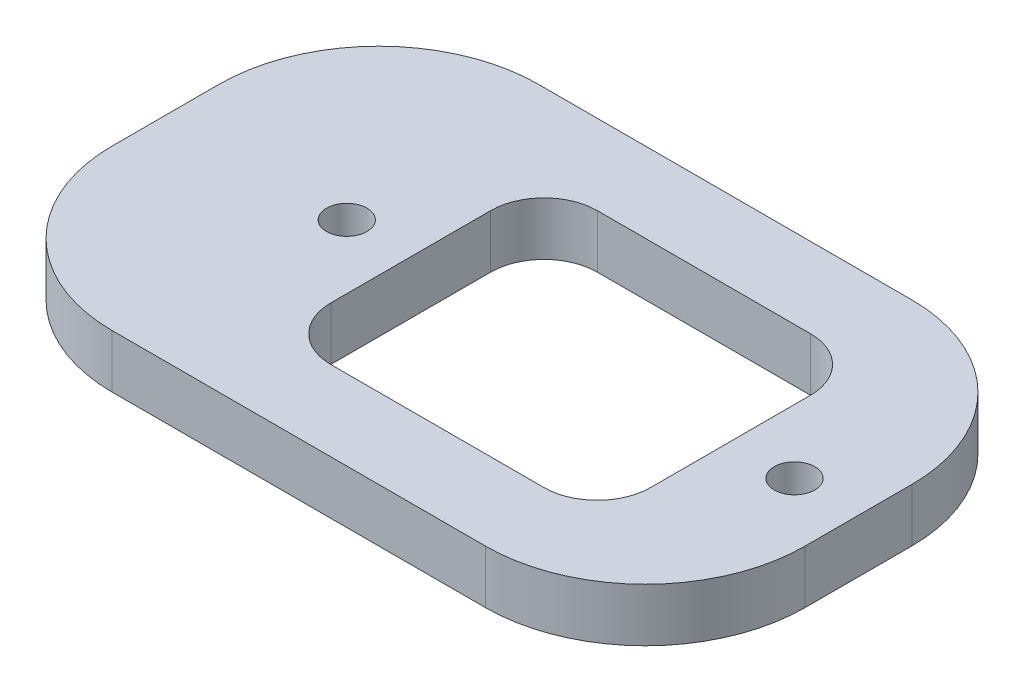
ISO-10303-21;
HEADER;
FILE_DESCRIPTION(('STEP AP214'),'2;1');
FILE_NAME('part.step','',(''),(''),'','','');
FILE_SCHEMA(('AUTOMOTIVE_DESIGN { 1 0 10303 214 1 1 1 1 }'));
ENDSEC;
DATA;
#1=APPLICATION_CONTEXT('core data for automotive mechanical design processes');
#2=APPLICATION_PROTOCOL_DEFINITION('international standard','automotive_design',2000,#1);
#3=PRODUCT_CONTEXT('',#1,'mechanical');
#4=PRODUCT('Part','Part','',(#3));
#5=PRODUCT_RELATED_PRODUCT_CATEGORY('part','',(#4));
#6=PRODUCT_DEFINITION_FORMATION('','',#4);
#7=PRODUCT_DEFINITION_CONTEXT('part definition',#1,'design');
#8=PRODUCT_DEFINITION('design','',#6,#7);
#9=PRODUCT_DEFINITION_SHAPE('','',#8);
#10=(LENGTH_UNIT() NAMED_UNIT(*) SI_UNIT(.MILLI.,.METRE.));
#11=(NAMED_UNIT(*) PLANE_ANGLE_UNIT() SI_UNIT($,.RADIAN.));
#12=(NAMED_UNIT(*) SI_UNIT($,.STERADIAN.) SOLID_ANGLE_UNIT());
#13=UNCERTAINTY_MEASURE_WITH_UNIT(LENGTH_MEASURE(1.E-05),#10,'distance_accuracy_value','');
#14=(GEOMETRIC_REPRESENTATION_CONTEXT(3) GLOBAL_UNCERTAINTY_ASSIGNED_CONTEXT((#13)) GLOBAL_UNIT_ASSIGNED_CONTEXT((#10,
#11,#12)) REPRESENTATION_CONTEXT('',''));
#15=CARTESIAN_POINT('',(0.,0.,0.));
#16=DIRECTION('',(0.,0.,1.));
#17=DIRECTION('',(1.,0.,0.));
#18=AXIS2_PLACEMENT_3D('',#15,#16,#17);
#19=CARTESIAN_POINT('',(13.97,6.35,12.7));
#20=DIRECTION('',(0.,1.,0.));
#21=DIRECTION('',(0.,0.,1.));
#22=AXIS2_PLACEMENT_3D('',#19,#20,#21);
#23=PLANE('',#22);
#24=CARTESIAN_POINT('',(-27.94,6.35,19.05));
#25=DIRECTION('',(0.,-1.,0.));
#26=DIRECTION('',(0.,0.,-1.));
#27=AXIS2_PLACEMENT_3D('',#24,#25,#26);
#28=CIRCLE('',#27,2.413);
#29=CARTESIAN_POINT('',(-27.94,6.35,16.637));
#30=VERTEX_POINT('',#29);
#31=EDGE_CURVE('E385',#30,#30,#28,.T.);
#32=ORIENTED_EDGE('',*,*,#31,.T.);
#33=EDGE_LOOP('',(#32));
#34=FACE_BOUND('',#33,.T.);
#35=CARTESIAN_POINT('',(25.4,6.35,19.05));
#36=DIRECTION('',(0.,-1.,0.));
#37=DIRECTION('',(0.,0.,-1.));
#38=AXIS2_PLACEMENT_3D('',#35,#36,#37);
#39=CIRCLE('',#38,2.413);
#40=CARTESIAN_POINT('',(25.4,6.35,16.637));
#41=VERTEX_POINT('',#40);
#42=EDGE_CURVE('E183',#41,#41,#39,.T.);
#43=ORIENTED_EDGE('',*,*,#42,.T.);
#44=EDGE_LOOP('',(#43));
#45=FACE_BOUND('',#44,.T.);
#46=CARTESIAN_POINT('',(13.97,6.35,12.7));
#47=DIRECTION('',(0.,1.,0.));
#48=DIRECTION('',(0.,0.,1.));
#49=AXIS2_PLACEMENT_3D('',#46,#47,#48);
#50=CIRCLE('',#49,19.05);
#51=CARTESIAN_POINT('',(33.02,6.35,12.7));
#52=VERTEX_POINT('',#51);
#53=CARTESIAN_POINT('',(13.97,6.35,-6.34999999999997));
#54=VERTEX_POINT('',#53);
#55=EDGE_CURVE('E214',#52,#54,#50,.T.);
#56=ORIENTED_EDGE('',*,*,#55,.T.);
#57=DIRECTION('',(-1.,0.,0.));
#58=VECTOR('',#57,1.);
#59=CARTESIAN_POINT('',(13.97,6.35,-6.34999999999997));
#60=LINE('',#59,#58);
#61=CARTESIAN_POINT('',(-30.48,6.35,-6.34999999999997));
#62=VERTEX_POINT('',#61);
#63=EDGE_CURVE('E217',#54,#62,#60,.T.);
#64=ORIENTED_EDGE('',*,*,#63,.T.);
#65=CARTESIAN_POINT('',(-30.48,6.35,12.7));
#66=DIRECTION('',(0.,1.,0.));
#67=DIRECTION('',(0.,0.,1.));
#68=AXIS2_PLACEMENT_3D('',#65,#66,#67);
#69=CIRCLE('',#68,19.05);
#70=CARTESIAN_POINT('',(-49.53,6.35,12.7));
#71=VERTEX_POINT('',#70);
#72=EDGE_CURVE('E220',#62,#71,#69,.T.);
#73=ORIENTED_EDGE('',*,*,#72,.T.);
#74=DIRECTION('',(0.,0.,1.));
#75=VECTOR('',#74,1.);
#76=CARTESIAN_POINT('',(-49.53,6.35,12.7));
#77=LINE('',#76,#75);
#78=CARTESIAN_POINT('',(-49.53,6.35,25.4));
#79=VERTEX_POINT('',#78);
#80=EDGE_CURVE('E222',#71,#79,#77,.T.);
#81=ORIENTED_EDGE('',*,*,#80,.T.);
#82=CARTESIAN_POINT('',(-30.48,6.35,25.4));
#83=DIRECTION('',(0.,1.,0.));
#84=DIRECTION('',(0.,0.,1.));
#85=AXIS2_PLACEMENT_3D('',#82,#83,#84);
#86=CIRCLE('',#85,19.05);
#87=CARTESIAN_POINT('',(-30.48,6.35,44.45));
#88=VERTEX_POINT('',#87);
#89=EDGE_CURVE('E224',#79,#88,#86,.T.);
#90=ORIENTED_EDGE('',*,*,#89,.T.);
#91=DIRECTION('',(1.,0.,0.));
#92=VECTOR('',#91,1.);
#93=CARTESIAN_POINT('',(13.97,6.35,44.45));
#94=LINE('',#93,#92);
#95=CARTESIAN_POINT('',(13.97,6.35,44.45));
#96=VERTEX_POINT('',#95);
#97=EDGE_CURVE('E226',#88,#96,#94,.T.);
#98=ORIENTED_EDGE('',*,*,#97,.T.);
#99=CARTESIAN_POINT('',(13.97,6.35,25.4));
#100=DIRECTION('',(0.,1.,0.));
#101=DIRECTION('',(0.,0.,-1.));
#102=AXIS2_PLACEMENT_3D('',#99,#100,#101);
#103=CIRCLE('',#102,19.05);
#104=CARTESIAN_POINT('',(33.02,6.35,25.4));
#105=VERTEX_POINT('',#104);
#106=EDGE_CURVE('E228',#96,#105,#103,.T.);
#107=ORIENTED_EDGE('',*,*,#106,.T.);
#108=DIRECTION('',(0.,0.,-1.));
#109=VECTOR('',#108,1.);
#110=CARTESIAN_POINT('',(33.02,6.35,12.7));
#111=LINE('',#110,#109);
#112=EDGE_CURVE('E230',#105,#52,#111,.T.);
#113=ORIENTED_EDGE('',*,*,#112,.T.);
#114=EDGE_LOOP('',(#56,#64,#73,#81,#90,#98,#107,#113));
#115=FACE_BOUND('',#114,.T.);
#116=CARTESIAN_POINT('',(-13.97,6.35,28.575));
#117=DIRECTION('',(0.,1.,0.));
#118=DIRECTION('',(0.,0.,1.));
#119=AXIS2_PLACEMENT_3D('',#116,#117,#118);
#120=CIRCLE('',#119,6.35);
#121=CARTESIAN_POINT('',(-20.32,6.35,28.575));
#122=VERTEX_POINT('',#121);
#123=CARTESIAN_POINT('',(-13.9699999999999,6.35,34.925));
#124=VERTEX_POINT('',#123);
#125=EDGE_CURVE('E152',#122,#124,#120,.T.);
#126=ORIENTED_EDGE('',*,*,#125,.F.);
#127=DIRECTION('',(0.,0.,1.));
#128=VECTOR('',#127,1.);
#129=CARTESIAN_POINT('',(-20.32,6.35,12.7));
#130=LINE('',#129,#128);
#131=CARTESIAN_POINT('',(-20.32,6.35,9.52500000000009));
#132=VERTEX_POINT('',#131);
#133=EDGE_CURVE('E144',#132,#122,#130,.T.);
#134=ORIENTED_EDGE('',*,*,#133,.F.);
#135=CARTESIAN_POINT('',(-13.97,6.35,9.52500000000004));
#136=DIRECTION('',(0.,1.,0.));
#137=DIRECTION('',(0.,0.,-1.));
#138=AXIS2_PLACEMENT_3D('',#135,#136,#137);
#139=CIRCLE('',#138,6.35);
#140=CARTESIAN_POINT('',(-13.9699999999999,6.35,3.17500000000004));
#141=VERTEX_POINT('',#140);
#142=EDGE_CURVE('E179',#141,#132,#139,.T.);
#143=ORIENTED_EDGE('',*,*,#142,.F.);
#144=DIRECTION('',(-1.,0.,0.));
#145=VECTOR('',#144,1.);
#146=CARTESIAN_POINT('',(-13.9699999999999,6.35,3.17500000000004));
#147=LINE('',#146,#145);
#148=CARTESIAN_POINT('',(11.43,6.35,3.17500000000004));
#149=VERTEX_POINT('',#148);
#150=EDGE_CURVE('E177',#149,#141,#147,.T.);
#151=ORIENTED_EDGE('',*,*,#150,.F.);
#152=CARTESIAN_POINT('',(11.43,6.35,9.52500000000004));
#153=DIRECTION('',(0.,1.,0.));
#154=DIRECTION('',(0.,0.,1.));
#155=AXIS2_PLACEMENT_3D('',#152,#153,#154);
#156=CIRCLE('',#155,6.35);
#157=CARTESIAN_POINT('',(17.78,6.35,9.52500000000008));
#158=VERTEX_POINT('',#157);
#159=EDGE_CURVE('E175',#158,#149,#156,.T.);
#160=ORIENTED_EDGE('',*,*,#159,.F.);
#161=DIRECTION('',(0.,0.,-1.));
#162=VECTOR('',#161,1.);
#163=CARTESIAN_POINT('',(17.78,6.35,25.4));
#164=LINE('',#163,#162);
#165=CARTESIAN_POINT('',(17.78,6.35,28.575));
#166=VERTEX_POINT('',#165);
#167=EDGE_CURVE('E173',#166,#158,#164,.T.);
#168=ORIENTED_EDGE('',*,*,#167,.F.);
#169=CARTESIAN_POINT('',(11.43,6.35,28.575));
#170=DIRECTION('',(0.,1.,0.));
#171=DIRECTION('',(0.,0.,1.));
#172=AXIS2_PLACEMENT_3D('',#169,#170,#171);
#173=CIRCLE('',#172,6.35);
#174=CARTESIAN_POINT('',(11.43,6.35,34.925));
#175=VERTEX_POINT('',#174);
#176=EDGE_CURVE('E168',#175,#166,#173,.T.);
#177=ORIENTED_EDGE('',*,*,#176,.F.);
#178=DIRECTION('',(1.,0.,0.));
#179=VECTOR('',#178,1.);
#180=CARTESIAN_POINT('',(-13.9699999999999,6.35,34.925));
#181=LINE('',#180,#179);
#182=EDGE_CURVE('E166',#124,#175,#181,.T.);
#183=ORIENTED_EDGE('',*,*,#182,.F.);
#184=EDGE_LOOP('',(#126,#134,#143,#151,#160,#168,#177,#183));
#185=FACE_BOUND('',#184,.T.);
#186=ADVANCED_FACE('F33',(#34,#45,#115,#185),#23,.T.);
#187=CARTESIAN_POINT('',(13.97,0.,12.7));
#188=DIRECTION('',(0.,1.,0.));
#189=DIRECTION('',(0.,0.,1.));
#190=AXIS2_PLACEMENT_3D('',#187,#188,#189);
#191=PLANE('',#190);
#192=CARTESIAN_POINT('',(-27.94,0.,19.05));
#193=DIRECTION('',(0.,-1.,0.));
#194=DIRECTION('',(0.,0.,-1.));
#195=AXIS2_PLACEMENT_3D('',#192,#193,#194);
#196=CIRCLE('',#195,4.7625);
#197=CARTESIAN_POINT('',(-27.94,0.,14.2875));
#198=VERTEX_POINT('',#197);
#199=EDGE_CURVE('E383',#198,#198,#196,.T.);
#200=ORIENTED_EDGE('',*,*,#199,.F.);
#201=EDGE_LOOP('',(#200));
#202=FACE_BOUND('',#201,.T.);
#203=CARTESIAN_POINT('',(25.4,0.,19.05));
#204=DIRECTION('',(0.,-1.,0.));
#205=DIRECTION('',(0.,0.,-1.));
#206=AXIS2_PLACEMENT_3D('',#203,#204,#205);
#207=CIRCLE('',#206,4.7625);
#208=CARTESIAN_POINT('',(25.4,0.,14.2875));
#209=VERTEX_POINT('',#208);
#210=EDGE_CURVE('E389',#209,#209,#207,.T.);
#211=ORIENTED_EDGE('',*,*,#210,.F.);
#212=EDGE_LOOP('',(#211));
#213=FACE_BOUND('',#212,.T.);
#214=CARTESIAN_POINT('',(13.97,0.,12.7));
#215=DIRECTION('',(0.,1.,0.));
#216=DIRECTION('',(0.,0.,1.));
#217=AXIS2_PLACEMENT_3D('',#214,#215,#216);
#218=CIRCLE('',#217,19.05);
#219=CARTESIAN_POINT('',(33.02,0.,12.7));
#220=VERTEX_POINT('',#219);
#221=CARTESIAN_POINT('',(13.97,0.,-6.34999999999997));
#222=VERTEX_POINT('',#221);
#223=EDGE_CURVE('E161',#220,#222,#218,.T.);
#224=ORIENTED_EDGE('',*,*,#223,.F.);
#225=DIRECTION('',(0.,0.,-1.));
#226=VECTOR('',#225,1.);
#227=CARTESIAN_POINT('',(33.02,0.,12.7));
#228=LINE('',#227,#226);
#229=CARTESIAN_POINT('',(33.02,0.,25.4));
#230=VERTEX_POINT('',#229);
#231=EDGE_CURVE('E218',#230,#220,#228,.T.);
#232=ORIENTED_EDGE('',*,*,#231,.F.);
#233=CARTESIAN_POINT('',(13.97,0.,25.4));
#234=DIRECTION('',(0.,1.,0.));
#235=DIRECTION('',(0.,0.,-1.));
#236=AXIS2_PLACEMENT_3D('',#233,#234,#235);
#237=CIRCLE('',#236,19.05);
#238=CARTESIAN_POINT('',(13.97,0.,44.45));
#239=VERTEX_POINT('',#238);
#240=EDGE_CURVE('E245',#239,#230,#237,.T.);
#241=ORIENTED_EDGE('',*,*,#240,.F.);
#242=DIRECTION('',(1.,0.,0.));
#243=VECTOR('',#242,1.);
#244=CARTESIAN_POINT('',(13.97,0.,44.45));
#245=LINE('',#244,#243);
#246=CARTESIAN_POINT('',(-30.48,0.,44.45));
#247=VERTEX_POINT('',#246);
#248=EDGE_CURVE('E243',#247,#239,#245,.T.);
#249=ORIENTED_EDGE('',*,*,#248,.F.);
#250=CARTESIAN_POINT('',(-30.48,0.,25.4));
#251=DIRECTION('',(0.,1.,0.));
#252=DIRECTION('',(0.,0.,1.));
#253=AXIS2_PLACEMENT_3D('',#250,#251,#252);
#254=CIRCLE('',#253,19.05);
#255=CARTESIAN_POINT('',(-49.53,0.,25.4));
#256=VERTEX_POINT('',#255);
#257=EDGE_CURVE('E241',#256,#247,#254,.T.);
#258=ORIENTED_EDGE('',*,*,#257,.F.);
#259=DIRECTION('',(0.,0.,1.));
#260=VECTOR('',#259,1.);
#261=CARTESIAN_POINT('',(-49.53,0.,12.7));
#262=LINE('',#261,#260);
#263=CARTESIAN_POINT('',(-49.53,0.,12.7));
#264=VERTEX_POINT('',#263);
#265=EDGE_CURVE('E239',#264,#256,#262,.T.);
#266=ORIENTED_EDGE('',*,*,#265,.F.);
#267=CARTESIAN_POINT('',(-30.48,0.,12.7));
#268=DIRECTION('',(0.,1.,0.));
#269=DIRECTION('',(0.,0.,1.));
#270=AXIS2_PLACEMENT_3D('',#267,#268,#269);
#271=CIRCLE('',#270,19.05);
#272=CARTESIAN_POINT('',(-30.48,0.,-6.34999999999997));
#273=VERTEX_POINT('',#272);
#274=EDGE_CURVE('E237',#273,#264,#271,.T.);
#275=ORIENTED_EDGE('',*,*,#274,.F.);
#276=DIRECTION('',(-1.,0.,0.));
#277=VECTOR('',#276,1.);
#278=CARTESIAN_POINT('',(13.97,0.,-6.34999999999997));
#279=LINE('',#278,#277);
#280=EDGE_CURVE('E235',#222,#273,#279,.T.);
#281=ORIENTED_EDGE('',*,*,#280,.F.);
#282=EDGE_LOOP('',(#224,#232,#241,#249,#258,#266,#275,#281));
#283=FACE_BOUND('',#282,.T.);
#284=DIRECTION('',(0.,0.,1.));
#285=VECTOR('',#284,1.);
#286=CARTESIAN_POINT('',(-20.32,0.,25.4));
#287=LINE('',#286,#285);
#288=CARTESIAN_POINT('',(-20.32,0.,9.52500000000009));
#289=VERTEX_POINT('',#288);
#290=CARTESIAN_POINT('',(-20.32,0.,28.575));
#291=VERTEX_POINT('',#290);
#292=EDGE_CURVE('E181',#289,#291,#287,.T.);
#293=ORIENTED_EDGE('',*,*,#292,.T.);
#294=CARTESIAN_POINT('',(-13.97,0.,28.575));
#295=DIRECTION('',(0.,1.,0.));
#296=DIRECTION('',(0.,0.,1.));
#297=AXIS2_PLACEMENT_3D('',#294,#295,#296);
#298=CIRCLE('',#297,6.35);
#299=CARTESIAN_POINT('',(-13.9699999999999,0.,34.925));
#300=VERTEX_POINT('',#299);
#301=EDGE_CURVE('E159',#291,#300,#298,.T.);
#302=ORIENTED_EDGE('',*,*,#301,.T.);
#303=DIRECTION('',(1.,0.,0.));
#304=VECTOR('',#303,1.);
#305=CARTESIAN_POINT('',(-13.9699999999999,0.,34.925));
#306=LINE('',#305,#304);
#307=CARTESIAN_POINT('',(11.43,0.,34.925));
#308=VERTEX_POINT('',#307);
#309=EDGE_CURVE('E185',#300,#308,#306,.T.);
#310=ORIENTED_EDGE('',*,*,#309,.T.);
#311=CARTESIAN_POINT('',(11.43,0.,28.575));
#312=DIRECTION('',(0.,1.,0.));
#313=DIRECTION('',(0.,0.,1.));
#314=AXIS2_PLACEMENT_3D('',#311,#312,#313);
#315=CIRCLE('',#314,6.35);
#316=CARTESIAN_POINT('',(17.78,0.,28.575));
#317=VERTEX_POINT('',#316);
#318=EDGE_CURVE('E188',#308,#317,#315,.T.);
#319=ORIENTED_EDGE('',*,*,#318,.T.);
#320=DIRECTION('',(0.,0.,-1.));
#321=VECTOR('',#320,1.);
#322=CARTESIAN_POINT('',(17.78,0.,12.7));
#323=LINE('',#322,#321);
#324=CARTESIAN_POINT('',(17.78,0.,9.52500000000008));
#325=VERTEX_POINT('',#324);
#326=EDGE_CURVE('E191',#317,#325,#323,.T.);
#327=ORIENTED_EDGE('',*,*,#326,.T.);
#328=CARTESIAN_POINT('',(11.43,0.,9.52500000000004));
#329=DIRECTION('',(0.,1.,0.));
#330=DIRECTION('',(0.,0.,1.));
#331=AXIS2_PLACEMENT_3D('',#328,#329,#330);
#332=CIRCLE('',#331,6.35);
#333=CARTESIAN_POINT('',(11.43,0.,3.17500000000004));
#334=VERTEX_POINT('',#333);
#335=EDGE_CURVE('E194',#325,#334,#332,.T.);
#336=ORIENTED_EDGE('',*,*,#335,.T.);
#337=DIRECTION('',(-1.,0.,0.));
#338=VECTOR('',#337,1.);
#339=CARTESIAN_POINT('',(-13.9699999999999,0.,3.17500000000004));
#340=LINE('',#339,#338);
#341=CARTESIAN_POINT('',(-13.9699999999999,0.,3.17500000000004));
#342=VERTEX_POINT('',#341);
#343=EDGE_CURVE('E197',#334,#342,#340,.T.);
#344=ORIENTED_EDGE('',*,*,#343,.T.);
#345=CARTESIAN_POINT('',(-13.97,0.,9.52500000000004));
#346=DIRECTION('',(0.,1.,0.));
#347=DIRECTION('',(0.,0.,-1.));
#348=AXIS2_PLACEMENT_3D('',#345,#346,#347);
#349=CIRCLE('',#348,6.35);
#350=EDGE_CURVE('E153',#342,#289,#349,.T.);
#351=ORIENTED_EDGE('',*,*,#350,.T.);
#352=EDGE_LOOP('',(#293,#302,#310,#319,#327,#336,#344,#351));
#353=FACE_BOUND('',#352,.T.);
#354=ADVANCED_FACE('F275',(#202,#213,#283,#353),#191,.F.);
#355=CARTESIAN_POINT('',(13.97,6.35,12.7));
#356=DIRECTION('',(0.,-1.,0.));
#357=DIRECTION('',(0.,0.,-1.));
#358=AXIS2_PLACEMENT_3D('',#355,#356,#357);
#359=CYLINDRICAL_SURFACE('',#358,19.05);
#360=ORIENTED_EDGE('',*,*,#223,.T.);
#361=DIRECTION('',(0.,-1.,0.));
#362=VECTOR('',#361,1.);
#363=CARTESIAN_POINT('',(13.97,6.35,-6.34999999999997));
#364=LINE('',#363,#362);
#365=EDGE_CURVE('E11',#54,#222,#364,.T.);
#366=ORIENTED_EDGE('',*,*,#365,.F.);
#367=ORIENTED_EDGE('',*,*,#55,.F.);
#368=DIRECTION('',(0.,-1.,0.));
#369=VECTOR('',#368,1.);
#370=CARTESIAN_POINT('',(33.02,6.35,12.7));
#371=LINE('',#370,#369);
#372=EDGE_CURVE('E232',#52,#220,#371,.T.);
#373=ORIENTED_EDGE('',*,*,#372,.T.);
#374=EDGE_LOOP('',(#360,#366,#367,#373));
#375=FACE_BOUND('',#374,.T.);
#376=ADVANCED_FACE('F35',(#375),#359,.T.);
#377=CARTESIAN_POINT('',(13.97,6.35,-6.34999999999997));
#378=DIRECTION('',(0.,0.,1.));
#379=DIRECTION('',(1.,0.,0.));
#380=AXIS2_PLACEMENT_3D('',#377,#378,#379);
#381=PLANE('',#380);
#382=ORIENTED_EDGE('',*,*,#280,.T.);
#383=DIRECTION('',(0.,-1.,0.));
#384=VECTOR('',#383,1.);
#385=CARTESIAN_POINT('',(-30.48,6.35,-6.34999999999997));
#386=LINE('',#385,#384);
#387=EDGE_CURVE('E41',#62,#273,#386,.T.);
#388=ORIENTED_EDGE('',*,*,#387,.F.);
#389=ORIENTED_EDGE('',*,*,#63,.F.);
#390=ORIENTED_EDGE('',*,*,#365,.T.);
#391=EDGE_LOOP('',(#382,#388,#389,#390));
#392=FACE_BOUND('',#391,.T.);
#393=ADVANCED_FACE('F292',(#392),#381,.F.);
#394=CARTESIAN_POINT('',(-30.48,6.35,12.7));
#395=DIRECTION('',(0.,-1.,0.));
#396=DIRECTION('',(0.,0.,-1.));
#397=AXIS2_PLACEMENT_3D('',#394,#395,#396);
#398=CYLINDRICAL_SURFACE('',#397,19.05);
#399=ORIENTED_EDGE('',*,*,#274,.T.);
#400=DIRECTION('',(0.,-1.,0.));
#401=VECTOR('',#400,1.);
#402=CARTESIAN_POINT('',(-49.53,6.35,12.7));
#403=LINE('',#402,#401);
#404=EDGE_CURVE('E262',#71,#264,#403,.T.);
#405=ORIENTED_EDGE('',*,*,#404,.F.);
#406=ORIENTED_EDGE('',*,*,#72,.F.);
#407=ORIENTED_EDGE('',*,*,#387,.T.);
#408=EDGE_LOOP('',(#399,#405,#406,#407));
#409=FACE_BOUND('',#408,.T.);
#410=ADVANCED_FACE('F269',(#409),#398,.T.);
#411=CARTESIAN_POINT('',(-49.53,6.35,12.7));
#412=DIRECTION('',(1.,0.,0.));
#413=DIRECTION('',(0.,0.,-1.));
#414=AXIS2_PLACEMENT_3D('',#411,#412,#413);
#415=PLANE('',#414);
#416=ORIENTED_EDGE('',*,*,#265,.T.);
#417=DIRECTION('',(0.,-1.,0.));
#418=VECTOR('',#417,1.);
#419=CARTESIAN_POINT('',(-49.53,6.35,25.4));
#420=LINE('',#419,#418);
#421=EDGE_CURVE('E259',#79,#256,#420,.T.);
#422=ORIENTED_EDGE('',*,*,#421,.F.);
#423=ORIENTED_EDGE('',*,*,#80,.F.);
#424=ORIENTED_EDGE('',*,*,#404,.T.);
#425=EDGE_LOOP('',(#416,#422,#423,#424));
#426=FACE_BOUND('',#425,.T.);
#427=ADVANCED_FACE('F281',(#426),#415,.F.);
#428=CARTESIAN_POINT('',(-30.48,6.35,25.4));
#429=DIRECTION('',(0.,-1.,0.));
#430=DIRECTION('',(0.,0.,-1.));
#431=AXIS2_PLACEMENT_3D('',#428,#429,#430);
#432=CYLINDRICAL_SURFACE('',#431,19.05);
#433=ORIENTED_EDGE('',*,*,#257,.T.);
#434=DIRECTION('',(0.,-1.,0.));
#435=VECTOR('',#434,1.);
#436=CARTESIAN_POINT('',(-30.48,6.35,44.45));
#437=LINE('',#436,#435);
#438=EDGE_CURVE('E256',#88,#247,#437,.T.);
#439=ORIENTED_EDGE('',*,*,#438,.F.);
#440=ORIENTED_EDGE('',*,*,#89,.F.);
#441=ORIENTED_EDGE('',*,*,#421,.T.);
#442=EDGE_LOOP('',(#433,#439,#440,#441));
#443=FACE_BOUND('',#442,.T.);
#444=ADVANCED_FACE('F285',(#443),#432,.T.);
#445=CARTESIAN_POINT('',(13.97,6.35,44.45));
#446=DIRECTION('',(0.,0.,-1.));
#447=DIRECTION('',(-1.,0.,0.));
#448=AXIS2_PLACEMENT_3D('',#445,#446,#447);
#449=PLANE('',#448);
#450=ORIENTED_EDGE('',*,*,#248,.T.);
#451=DIRECTION('',(0.,-1.,0.));
#452=VECTOR('',#451,1.);
#453=CARTESIAN_POINT('',(13.97,6.35,44.45));
#454=LINE('',#453,#452);
#455=EDGE_CURVE('E253',#96,#239,#454,.T.);
#456=ORIENTED_EDGE('',*,*,#455,.F.);
#457=ORIENTED_EDGE('',*,*,#97,.F.);
#458=ORIENTED_EDGE('',*,*,#438,.T.);
#459=EDGE_LOOP('',(#450,#456,#457,#458));
#460=FACE_BOUND('',#459,.T.);
#461=ADVANCED_FACE('F305',(#460),#449,.F.);
#462=CARTESIAN_POINT('',(13.97,6.35,25.4));
#463=DIRECTION('',(0.,-1.,0.));
#464=DIRECTION('',(0.,0.,-1.));
#465=AXIS2_PLACEMENT_3D('',#462,#463,#464);
#466=CYLINDRICAL_SURFACE('',#465,19.05);
#467=ORIENTED_EDGE('',*,*,#240,.T.);
#468=DIRECTION('',(0.,-1.,0.));
#469=VECTOR('',#468,1.);
#470=CARTESIAN_POINT('',(33.02,6.35,25.4));
#471=LINE('',#470,#469);
#472=EDGE_CURVE('E250',#105,#230,#471,.T.);
#473=ORIENTED_EDGE('',*,*,#472,.F.);
#474=ORIENTED_EDGE('',*,*,#106,.F.);
#475=ORIENTED_EDGE('',*,*,#455,.T.);
#476=EDGE_LOOP('',(#467,#473,#474,#475));
#477=FACE_BOUND('',#476,.T.);
#478=ADVANCED_FACE('F303',(#477),#466,.T.);
#479=CARTESIAN_POINT('',(33.02,6.35,12.7));
#480=DIRECTION('',(-1.,0.,0.));
#481=DIRECTION('',(0.,0.,1.));
#482=AXIS2_PLACEMENT_3D('',#479,#480,#481);
#483=PLANE('',#482);
#484=ORIENTED_EDGE('',*,*,#231,.T.);
#485=ORIENTED_EDGE('',*,*,#372,.F.);
#486=ORIENTED_EDGE('',*,*,#112,.F.);
#487=ORIENTED_EDGE('',*,*,#472,.T.);
#488=EDGE_LOOP('',(#484,#485,#486,#487));
#489=FACE_BOUND('',#488,.T.);
#490=ADVANCED_FACE('F298',(#489),#483,.F.);
#491=CARTESIAN_POINT('',(-20.32,6.35,25.4));
#492=DIRECTION('',(1.,0.,0.));
#493=DIRECTION('',(0.,0.,-1.));
#494=AXIS2_PLACEMENT_3D('',#491,#492,#493);
#495=PLANE('',#494);
#496=ORIENTED_EDGE('',*,*,#292,.F.);
#497=DIRECTION('',(0.,-1.,0.));
#498=VECTOR('',#497,1.);
#499=CARTESIAN_POINT('',(-20.32,6.35,9.52500000000009));
#500=LINE('',#499,#498);
#501=EDGE_CURVE('E53',#132,#289,#500,.T.);
#502=ORIENTED_EDGE('',*,*,#501,.F.);
#503=ORIENTED_EDGE('',*,*,#133,.T.);
#504=DIRECTION('',(0.,-1.,0.));
#505=VECTOR('',#504,1.);
#506=CARTESIAN_POINT('',(-20.32,6.35,28.575));
#507=LINE('',#506,#505);
#508=EDGE_CURVE('E147',#122,#291,#507,.T.);
#509=ORIENTED_EDGE('',*,*,#508,.T.);
#510=EDGE_LOOP('',(#496,#502,#503,#509));
#511=FACE_BOUND('',#510,.T.);
#512=ADVANCED_FACE('F146',(#511),#495,.T.);
#513=CARTESIAN_POINT('',(-13.97,6.35,28.575));
#514=DIRECTION('',(0.,-1.,0.));
#515=DIRECTION('',(0.,0.,-1.));
#516=AXIS2_PLACEMENT_3D('',#513,#514,#515);
#517=CYLINDRICAL_SURFACE('',#516,6.35);
#518=ORIENTED_EDGE('',*,*,#301,.F.);
#519=ORIENTED_EDGE('',*,*,#508,.F.);
#520=ORIENTED_EDGE('',*,*,#125,.T.);
#521=DIRECTION('',(0.,-1.,0.));
#522=VECTOR('',#521,1.);
#523=CARTESIAN_POINT('',(-13.9699999999999,6.35,34.925));
#524=LINE('',#523,#522);
#525=EDGE_CURVE('E162',#124,#300,#524,.T.);
#526=ORIENTED_EDGE('',*,*,#525,.T.);
#527=EDGE_LOOP('',(#518,#519,#520,#526));
#528=FACE_BOUND('',#527,.T.);
#529=ADVANCED_FACE('F156',(#528),#517,.F.);
#530=CARTESIAN_POINT('',(-13.9699999999999,6.35,34.925));
#531=DIRECTION('',(0.,0.,-1.));
#532=DIRECTION('',(-1.,0.,0.));
#533=AXIS2_PLACEMENT_3D('',#530,#531,#532);
#534=PLANE('',#533);
#535=ORIENTED_EDGE('',*,*,#309,.F.);
#536=ORIENTED_EDGE('',*,*,#525,.F.);
#537=ORIENTED_EDGE('',*,*,#182,.T.);
#538=DIRECTION('',(0.,-1.,0.));
#539=VECTOR('',#538,1.);
#540=CARTESIAN_POINT('',(11.43,6.35,34.925));
#541=LINE('',#540,#539);
#542=EDGE_CURVE('E211',#175,#308,#541,.T.);
#543=ORIENTED_EDGE('',*,*,#542,.T.);
#544=EDGE_LOOP('',(#535,#536,#537,#543));
#545=FACE_BOUND('',#544,.T.);
#546=ADVANCED_FACE('F334',(#545),#534,.T.);
#547=CARTESIAN_POINT('',(11.43,6.35,28.575));
#548=DIRECTION('',(0.,-1.,0.));
#549=DIRECTION('',(0.,0.,-1.));
#550=AXIS2_PLACEMENT_3D('',#547,#548,#549);
#551=CYLINDRICAL_SURFACE('',#550,6.35);
#552=ORIENTED_EDGE('',*,*,#318,.F.);
#553=ORIENTED_EDGE('',*,*,#542,.F.);
#554=ORIENTED_EDGE('',*,*,#176,.T.);
#555=DIRECTION('',(0.,-1.,0.));
#556=VECTOR('',#555,1.);
#557=CARTESIAN_POINT('',(17.78,6.35,28.575));
#558=LINE('',#557,#556);
#559=EDGE_CURVE('E208',#166,#317,#558,.T.);
#560=ORIENTED_EDGE('',*,*,#559,.T.);
#561=EDGE_LOOP('',(#552,#553,#554,#560));
#562=FACE_BOUND('',#561,.T.);
#563=ADVANCED_FACE('F338',(#562),#551,.F.);
#564=CARTESIAN_POINT('',(17.78,6.35,12.7));
#565=DIRECTION('',(-1.,0.,0.));
#566=DIRECTION('',(0.,0.,1.));
#567=AXIS2_PLACEMENT_3D('',#564,#565,#566);
#568=PLANE('',#567);
#569=ORIENTED_EDGE('',*,*,#326,.F.);
#570=ORIENTED_EDGE('',*,*,#559,.F.);
#571=ORIENTED_EDGE('',*,*,#167,.T.);
#572=DIRECTION('',(0.,-1.,0.));
#573=VECTOR('',#572,1.);
#574=CARTESIAN_POINT('',(17.78,6.35,9.52500000000008));
#575=LINE('',#574,#573);
#576=EDGE_CURVE('E206',#158,#325,#575,.T.);
#577=ORIENTED_EDGE('',*,*,#576,.T.);
#578=EDGE_LOOP('',(#569,#570,#571,#577));
#579=FACE_BOUND('',#578,.T.);
#580=ADVANCED_FACE('F344',(#579),#568,.T.);
#581=CARTESIAN_POINT('',(11.43,6.35,9.52500000000004));
#582=DIRECTION('',(0.,-1.,0.));
#583=DIRECTION('',(0.,0.,-1.));
#584=AXIS2_PLACEMENT_3D('',#581,#582,#583);
#585=CYLINDRICAL_SURFACE('',#584,6.35);
#586=ORIENTED_EDGE('',*,*,#335,.F.);
#587=ORIENTED_EDGE('',*,*,#576,.F.);
#588=ORIENTED_EDGE('',*,*,#159,.T.);
#589=DIRECTION('',(0.,-1.,0.));
#590=VECTOR('',#589,1.);
#591=CARTESIAN_POINT('',(11.43,6.35,3.17500000000004));
#592=LINE('',#591,#590);
#593=EDGE_CURVE('E204',#149,#334,#592,.T.);
#594=ORIENTED_EDGE('',*,*,#593,.T.);
#595=EDGE_LOOP('',(#586,#587,#588,#594));
#596=FACE_BOUND('',#595,.T.);
#597=ADVANCED_FACE('F348',(#596),#585,.F.);
#598=CARTESIAN_POINT('',(-13.9699999999999,6.35,3.17500000000004));
#599=DIRECTION('',(0.,0.,1.));
#600=DIRECTION('',(1.,0.,0.));
#601=AXIS2_PLACEMENT_3D('',#598,#599,#600);
#602=PLANE('',#601);
#603=ORIENTED_EDGE('',*,*,#343,.F.);
#604=ORIENTED_EDGE('',*,*,#593,.F.);
#605=ORIENTED_EDGE('',*,*,#150,.T.);
#606=DIRECTION('',(0.,-1.,0.));
#607=VECTOR('',#606,1.);
#608=CARTESIAN_POINT('',(-13.9699999999999,6.35,3.17500000000004));
#609=LINE('',#608,#607);
#610=EDGE_CURVE('E48',#141,#342,#609,.T.);
#611=ORIENTED_EDGE('',*,*,#610,.T.);
#612=EDGE_LOOP('',(#603,#604,#605,#611));
#613=FACE_BOUND('',#612,.T.);
#614=ADVANCED_FACE('F352',(#613),#602,.T.);
#615=CARTESIAN_POINT('',(-13.97,6.35,9.52500000000004));
#616=DIRECTION('',(0.,-1.,0.));
#617=DIRECTION('',(0.,0.,-1.));
#618=AXIS2_PLACEMENT_3D('',#615,#616,#617);
#619=CYLINDRICAL_SURFACE('',#618,6.35);
#620=ORIENTED_EDGE('',*,*,#350,.F.);
#621=ORIENTED_EDGE('',*,*,#610,.F.);
#622=ORIENTED_EDGE('',*,*,#142,.T.);
#623=ORIENTED_EDGE('',*,*,#501,.T.);
#624=EDGE_LOOP('',(#620,#621,#622,#623));
#625=FACE_BOUND('',#624,.T.);
#626=ADVANCED_FACE('F356',(#625),#619,.F.);
#627=CARTESIAN_POINT('',(25.4,0.,19.05));
#628=DIRECTION('',(0.,-1.,0.));
#629=DIRECTION('',(0.,0.,-1.));
#630=AXIS2_PLACEMENT_3D('',#627,#628,#629);
#631=CYLINDRICAL_SURFACE('',#630,2.413);
#632=ORIENTED_EDGE('',*,*,#42,.F.);
#633=EDGE_LOOP('',(#632));
#634=FACE_BOUND('',#633,.T.);
#635=CARTESIAN_POINT('',(25.4,2.70279057276576,19.05));
#636=DIRECTION('',(0.,-1.,0.));
#637=DIRECTION('',(0.,0.,-1.));
#638=AXIS2_PLACEMENT_3D('',#635,#636,#637);
#639=CIRCLE('',#638,2.413);
#640=CARTESIAN_POINT('',(25.4,2.70279057276576,16.637));
#641=VERTEX_POINT('',#640);
#642=EDGE_CURVE('E392',#641,#641,#639,.T.);
#643=ORIENTED_EDGE('',*,*,#642,.T.);
#644=EDGE_LOOP('',(#643));
#645=FACE_BOUND('',#644,.T.);
#646=ADVANCED_FACE('F360',(#634,#645),#631,.F.);
#647=CARTESIAN_POINT('',(25.4,0.,19.05));
#648=DIRECTION('',(0.,-1.,0.));
#649=DIRECTION('',(0.,0.,-1.));
#650=AXIS2_PLACEMENT_3D('',#647,#648,#649);
#651=CONICAL_SURFACE('',#650,4.7625,0.715584993317675);
#652=ORIENTED_EDGE('',*,*,#642,.F.);
#653=EDGE_LOOP('',(#652));
#654=FACE_BOUND('',#653,.T.);
#655=ORIENTED_EDGE('',*,*,#210,.T.);
#656=EDGE_LOOP('',(#655));
#657=FACE_BOUND('',#656,.T.);
#658=ADVANCED_FACE('F363',(#654,#657),#651,.F.);
#659=CARTESIAN_POINT('',(-27.94,0.,19.05));
#660=DIRECTION('',(0.,-1.,0.));
#661=DIRECTION('',(0.,0.,-1.));
#662=AXIS2_PLACEMENT_3D('',#659,#660,#661);
#663=CYLINDRICAL_SURFACE('',#662,2.413);
#664=ORIENTED_EDGE('',*,*,#31,.F.);
#665=EDGE_LOOP('',(#664));
#666=FACE_BOUND('',#665,.T.);
#667=CARTESIAN_POINT('',(-27.94,2.70279057276576,19.05));
#668=DIRECTION('',(0.,-1.,0.));
#669=DIRECTION('',(0.,0.,-1.));
#670=AXIS2_PLACEMENT_3D('',#667,#668,#669);
#671=CIRCLE('',#670,2.413);
#672=CARTESIAN_POINT('',(-27.94,2.70279057276576,16.637));
#673=VERTEX_POINT('',#672);
#674=EDGE_CURVE('E380',#673,#673,#671,.T.);
#675=ORIENTED_EDGE('',*,*,#674,.T.);
#676=EDGE_LOOP('',(#675));
#677=FACE_BOUND('',#676,.T.);
#678=ADVANCED_FACE('F367',(#666,#677),#663,.F.);
#679=CARTESIAN_POINT('',(-27.94,0.,19.05));
#680=DIRECTION('',(0.,-1.,0.));
#681=DIRECTION('',(0.,0.,-1.));
#682=AXIS2_PLACEMENT_3D('',#679,#680,#681);
#683=CONICAL_SURFACE('',#682,4.7625,0.715584993317675);
#684=ORIENTED_EDGE('',*,*,#674,.F.);
#685=EDGE_LOOP('',(#684));
#686=FACE_BOUND('',#685,.T.);
#687=ORIENTED_EDGE('',*,*,#199,.T.);
#688=EDGE_LOOP('',(#687));
#689=FACE_BOUND('',#688,.T.);
#690=ADVANCED_FACE('F371',(#686,#689),#683,.F.);
#691=CLOSED_SHELL('',(#186,#354,#376,#393,#410,#427,#444,#461,#478,#490,#512,#529,#546,#563,
#580,#597,#614,#626,#646,#658,#678,#690));
#692=MANIFOLD_SOLID_BREP('B2',#691);
#693=ADVANCED_BREP_SHAPE_REPRESENTATION('',(#18,#692),#14);
#694=SHAPE_DEFINITION_REPRESENTATION(#9,#693);
ENDSEC;
END-ISO-10303-21;
